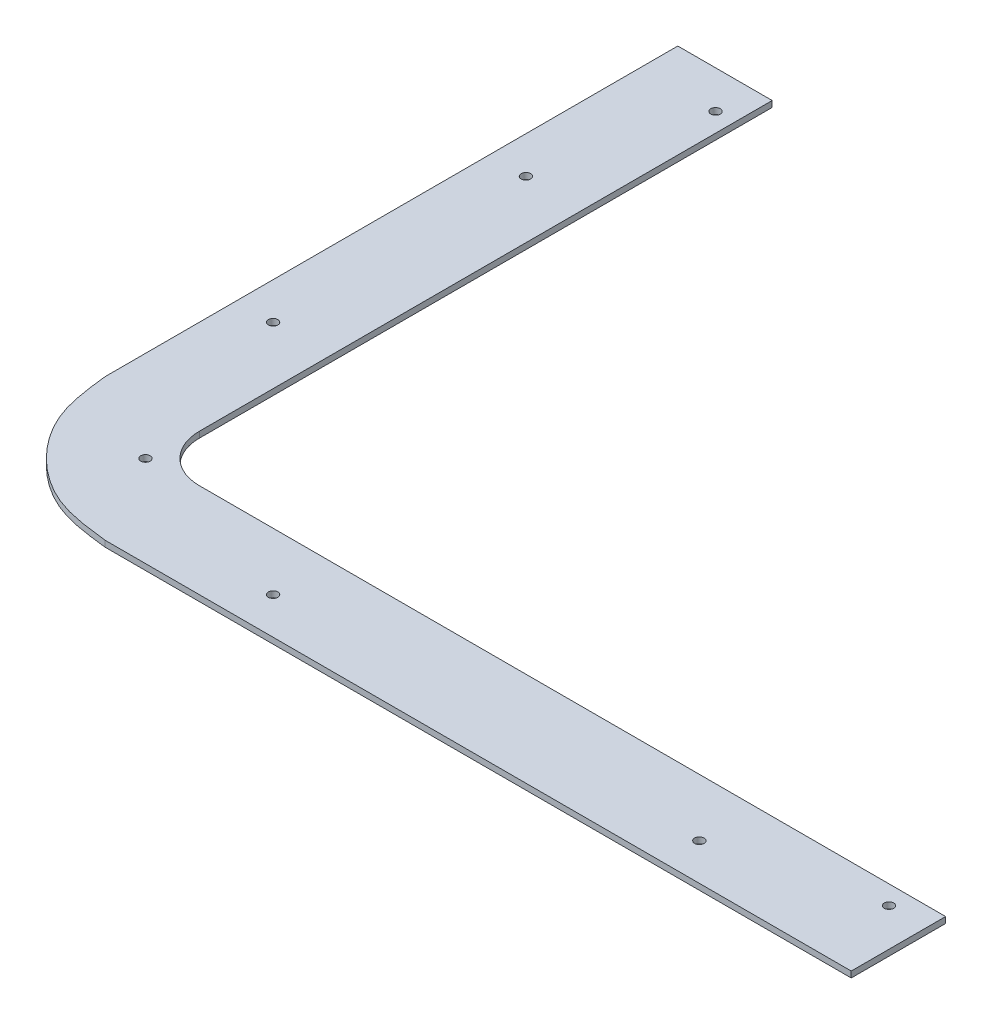
ISO-10303-21;
HEADER;
FILE_DESCRIPTION(('STEP AP214'),'2;1');
FILE_NAME('part.step','',(''),(''),'','','');
FILE_SCHEMA(('AUTOMOTIVE_DESIGN { 1 0 10303 214 1 1 1 1 }'));
ENDSEC;
DATA;
#1=APPLICATION_CONTEXT('core data for automotive mechanical design processes');
#2=APPLICATION_PROTOCOL_DEFINITION('international standard','automotive_design',2000,#1);
#3=PRODUCT_CONTEXT('',#1,'mechanical');
#4=PRODUCT('Part','Part','',(#3));
#5=PRODUCT_RELATED_PRODUCT_CATEGORY('part','',(#4));
#6=PRODUCT_DEFINITION_FORMATION('','',#4);
#7=PRODUCT_DEFINITION_CONTEXT('part definition',#1,'design');
#8=PRODUCT_DEFINITION('design','',#6,#7);
#9=PRODUCT_DEFINITION_SHAPE('','',#8);
#10=(LENGTH_UNIT() NAMED_UNIT(*) SI_UNIT(.MILLI.,.METRE.));
#11=(NAMED_UNIT(*) PLANE_ANGLE_UNIT() SI_UNIT($,.RADIAN.));
#12=(NAMED_UNIT(*) SI_UNIT($,.STERADIAN.) SOLID_ANGLE_UNIT());
#13=UNCERTAINTY_MEASURE_WITH_UNIT(LENGTH_MEASURE(1.E-05),#10,'distance_accuracy_value','');
#14=(GEOMETRIC_REPRESENTATION_CONTEXT(3) GLOBAL_UNCERTAINTY_ASSIGNED_CONTEXT((#13)) GLOBAL_UNIT_ASSIGNED_CONTEXT((#10,
#11,#12)) REPRESENTATION_CONTEXT('',''));
#15=CARTESIAN_POINT('',(0.,0.,0.));
#16=DIRECTION('',(0.,0.,1.));
#17=DIRECTION('',(1.,0.,0.));
#18=AXIS2_PLACEMENT_3D('',#15,#16,#17);
#19=CARTESIAN_POINT('',(145.271732748,-0.0101030776406552,220.));
#20=DIRECTION('',(-1.,0.,0.));
#21=DIRECTION('',(0.,0.,1.));
#22=AXIS2_PLACEMENT_3D('',#19,#20,#21);
#23=PLANE('',#22);
#24=DIRECTION('',(0.,0.,1.));
#25=VECTOR('',#24,1.);
#26=CARTESIAN_POINT('',(145.271732748,453.2,195.));
#27=LINE('',#26,#25);
#28=CARTESIAN_POINT('',(145.271732748,453.2,220.));
#29=VERTEX_POINT('',#28);
#30=CARTESIAN_POINT('',(145.271732748,453.2,270.));
#31=VERTEX_POINT('',#30);
#32=EDGE_CURVE('E109',#29,#31,#27,.T.);
#33=ORIENTED_EDGE('',*,*,#32,.T.);
#34=DIRECTION('',(0.,-1.,0.));
#35=VECTOR('',#34,1.);
#36=CARTESIAN_POINT('',(145.271732748,450.,270.));
#37=LINE('',#36,#35);
#38=CARTESIAN_POINT('',(145.271732748,450.,270.));
#39=VERTEX_POINT('',#38);
#40=EDGE_CURVE('E124',#31,#39,#37,.T.);
#41=ORIENTED_EDGE('',*,*,#40,.T.);
#42=DIRECTION('',(0.,0.,1.));
#43=VECTOR('',#42,1.);
#44=CARTESIAN_POINT('',(145.271732748,450.,195.));
#45=LINE('',#44,#43);
#46=CARTESIAN_POINT('',(145.271732748,450.,220.));
#47=VERTEX_POINT('',#46);
#48=EDGE_CURVE('E111',#47,#39,#45,.T.);
#49=ORIENTED_EDGE('',*,*,#48,.F.);
#50=DIRECTION('',(0.,1.,0.));
#51=VECTOR('',#50,1.);
#52=CARTESIAN_POINT('',(145.271732748,353.2,220.));
#53=LINE('',#52,#51);
#54=EDGE_CURVE('E106',#47,#29,#53,.T.);
#55=ORIENTED_EDGE('',*,*,#54,.T.);
#56=EDGE_LOOP('',(#33,#41,#49,#55));
#57=FACE_BOUND('',#56,.T.);
#58=ADVANCED_FACE('F38',(#57),#23,.F.);
#59=CARTESIAN_POINT('',(-275.,-0.0101030776406552,-108.396227551465));
#60=DIRECTION('',(0.,0.,-1.));
#61=DIRECTION('',(-1.,0.,0.));
#62=AXIS2_PLACEMENT_3D('',#59,#60,#61);
#63=PLANE('',#62);
#64=DIRECTION('',(-1.,0.,0.));
#65=VECTOR('',#64,1.);
#66=CARTESIAN_POINT('',(-250.,453.2,-108.396227551464));
#67=LINE('',#66,#65);
#68=CARTESIAN_POINT('',(-275.,453.2,-108.396227551465));
#69=VERTEX_POINT('',#68);
#70=CARTESIAN_POINT('',(-324.999999998909,453.2,-108.396227551464));
#71=VERTEX_POINT('',#70);
#72=EDGE_CURVE('E138',#69,#71,#67,.T.);
#73=ORIENTED_EDGE('',*,*,#72,.F.);
#74=DIRECTION('',(0.,1.,0.));
#75=VECTOR('',#74,1.);
#76=CARTESIAN_POINT('',(-275.,353.2,-108.396227551465));
#77=LINE('',#76,#75);
#78=CARTESIAN_POINT('',(-275.,450.,-108.396227551465));
#79=VERTEX_POINT('',#78);
#80=EDGE_CURVE('E63',#79,#69,#77,.T.);
#81=ORIENTED_EDGE('',*,*,#80,.F.);
#82=DIRECTION('',(-1.,0.,0.));
#83=VECTOR('',#82,1.);
#84=CARTESIAN_POINT('',(-250.,450.,-108.396227551464));
#85=LINE('',#84,#83);
#86=CARTESIAN_POINT('',(-324.999999998909,450.,-108.396227551464));
#87=VERTEX_POINT('',#86);
#88=EDGE_CURVE('E113',#79,#87,#85,.T.);
#89=ORIENTED_EDGE('',*,*,#88,.T.);
#90=DIRECTION('',(0.,-1.,0.));
#91=VECTOR('',#90,1.);
#92=CARTESIAN_POINT('',(-324.999999998909,450.,-108.396227551464));
#93=LINE('',#92,#91);
#94=EDGE_CURVE('E140',#71,#87,#93,.T.);
#95=ORIENTED_EDGE('',*,*,#94,.F.);
#96=EDGE_LOOP('',(#73,#81,#89,#95));
#97=FACE_BOUND('',#96,.T.);
#98=ADVANCED_FACE('F256',(#97),#63,.T.);
#99=CARTESIAN_POINT('',(-324.999999998909,450.,195.));
#100=DIRECTION('',(-1.,0.,0.));
#101=DIRECTION('',(0.,0.,1.));
#102=AXIS2_PLACEMENT_3D('',#99,#100,#101);
#103=PLANE('',#102);
#104=DIRECTION('',(0.,0.,1.));
#105=VECTOR('',#104,1.);
#106=CARTESIAN_POINT('',(-324.999999998909,453.2,195.));
#107=LINE('',#106,#105);
#108=CARTESIAN_POINT('',(-324.999999999454,453.2,195.));
#109=VERTEX_POINT('',#108);
#110=EDGE_CURVE('E169',#71,#109,#107,.T.);
#111=ORIENTED_EDGE('',*,*,#110,.F.);
#112=ORIENTED_EDGE('',*,*,#94,.T.);
#113=DIRECTION('',(0.,0.,1.));
#114=VECTOR('',#113,1.);
#115=CARTESIAN_POINT('',(-324.999999998909,450.,195.));
#116=LINE('',#115,#114);
#117=CARTESIAN_POINT('',(-324.999999999454,450.,195.));
#118=VERTEX_POINT('',#117);
#119=EDGE_CURVE('E135',#87,#118,#116,.T.);
#120=ORIENTED_EDGE('',*,*,#119,.T.);
#121=CARTESIAN_POINT('',(-325.,453.2,195.));
#122=CARTESIAN_POINT('',(-325.,450.,195.));
#123=B_SPLINE_CURVE_WITH_KNOTS('',1,(#121,#122),.UNSPECIFIED.,.F.,.F.,(2,2),(0.,1.),.UNSPECIFIED.);
#124=EDGE_CURVE('E188',#118,#109,#123,.F.);
#125=ORIENTED_EDGE('',*,*,#124,.T.);
#126=EDGE_LOOP('',(#111,#112,#120,#125));
#127=FACE_BOUND('',#126,.T.);
#128=ADVANCED_FACE('F258',(#127),#103,.T.);
#129=CARTESIAN_POINT('',(-250.,453.2,195.));
#130=DIRECTION('',(0.,1.,0.));
#131=DIRECTION('',(0.,0.,1.));
#132=AXIS2_PLACEMENT_3D('',#129,#130,#131);
#133=PLANE('',#132);
#134=CARTESIAN_POINT('',(-305.45,453.2,-8.39622755146451));
#135=DIRECTION('',(0.,1.,0.));
#136=DIRECTION('',(0.,0.,1.));
#137=AXIS2_PLACEMENT_3D('',#134,#135,#136);
#138=CIRCLE('',#137,2.50000000000002);
#139=CARTESIAN_POINT('',(-305.45,453.2,-5.89622755146448));
#140=VERTEX_POINT('',#139);
#141=EDGE_CURVE('E452',#140,#140,#138,.T.);
#142=ORIENTED_EDGE('',*,*,#141,.F.);
#143=EDGE_LOOP('',(#142));
#144=FACE_BOUND('',#143,.T.);
#145=CARTESIAN_POINT('',(-305.45,453.2,125.512644459873));
#146=DIRECTION('',(0.,1.,0.));
#147=DIRECTION('',(0.,0.,1.));
#148=AXIS2_PLACEMENT_3D('',#145,#146,#147);
#149=CIRCLE('',#148,2.50000000000002);
#150=CARTESIAN_POINT('',(-305.45,453.2,128.012644459873));
#151=VERTEX_POINT('',#150);
#152=EDGE_CURVE('E454',#151,#151,#149,.T.);
#153=ORIENTED_EDGE('',*,*,#152,.F.);
#154=EDGE_LOOP('',(#153));
#155=FACE_BOUND('',#154,.T.);
#156=CARTESIAN_POINT('',(-180.512645029273,453.2,250.45));
#157=DIRECTION('',(0.,1.,0.));
#158=DIRECTION('',(0.,0.,1.));
#159=AXIS2_PLACEMENT_3D('',#156,#157,#158);
#160=CIRCLE('',#159,2.5);
#161=CARTESIAN_POINT('',(-180.512645029273,453.2,252.95));
#162=VERTEX_POINT('',#161);
#163=EDGE_CURVE('E460',#162,#162,#160,.T.);
#164=ORIENTED_EDGE('',*,*,#163,.F.);
#165=EDGE_LOOP('',(#164));
#166=FACE_BOUND('',#165,.T.);
#167=CARTESIAN_POINT('',(45.2717327480002,453.2,250.45));
#168=DIRECTION('',(0.,1.,0.));
#169=DIRECTION('',(0.,0.,1.));
#170=AXIS2_PLACEMENT_3D('',#167,#168,#169);
#171=CIRCLE('',#170,2.50000000000001);
#172=CARTESIAN_POINT('',(45.2717327480002,453.2,252.95));
#173=VERTEX_POINT('',#172);
#174=EDGE_CURVE('E464',#173,#173,#171,.T.);
#175=ORIENTED_EDGE('',*,*,#174,.F.);
#176=EDGE_LOOP('',(#175));
#177=FACE_BOUND('',#176,.T.);
#178=CARTESIAN_POINT('',(-276.782224708341,453.2,221.782224708341));
#179=DIRECTION('',(0.,1.,0.));
#180=DIRECTION('',(0.,0.,1.));
#181=AXIS2_PLACEMENT_3D('',#178,#179,#180);
#182=CIRCLE('',#181,2.50000000000002);
#183=CARTESIAN_POINT('',(-276.782224708341,453.2,224.282224708341));
#184=VERTEX_POINT('',#183);
#185=EDGE_CURVE('E468',#184,#184,#182,.T.);
#186=ORIENTED_EDGE('',*,*,#185,.F.);
#187=EDGE_LOOP('',(#186));
#188=FACE_BOUND('',#187,.T.);
#189=CARTESIAN_POINT('',(125.271732748,453.2,230.));
#190=DIRECTION('',(0.,1.,0.));
#191=DIRECTION('',(0.,0.,1.));
#192=AXIS2_PLACEMENT_3D('',#189,#190,#191);
#193=CIRCLE('',#192,2.5);
#194=CARTESIAN_POINT('',(125.271732748,453.2,232.5));
#195=VERTEX_POINT('',#194);
#196=EDGE_CURVE('E471',#195,#195,#193,.T.);
#197=ORIENTED_EDGE('',*,*,#196,.F.);
#198=EDGE_LOOP('',(#197));
#199=FACE_BOUND('',#198,.T.);
#200=CARTESIAN_POINT('',(-285.,453.2,-88.3962275514643));
#201=DIRECTION('',(0.,1.,0.));
#202=DIRECTION('',(0.,0.,1.));
#203=AXIS2_PLACEMENT_3D('',#200,#201,#202);
#204=CIRCLE('',#203,2.50000000000002);
#205=CARTESIAN_POINT('',(-285.,453.2,-85.8962275514643));
#206=VERTEX_POINT('',#205);
#207=EDGE_CURVE('E473',#206,#206,#204,.T.);
#208=ORIENTED_EDGE('',*,*,#207,.F.);
#209=EDGE_LOOP('',(#208));
#210=FACE_BOUND('',#209,.T.);
#211=DIRECTION('',(0.,0.,1.));
#212=VECTOR('',#211,1.);
#213=CARTESIAN_POINT('',(-275.,453.2,-108.396227551465));
#214=LINE('',#213,#212);
#215=CARTESIAN_POINT('',(-275.,453.2,195.));
#216=VERTEX_POINT('',#215);
#217=EDGE_CURVE('E11',#69,#216,#214,.T.);
#218=ORIENTED_EDGE('',*,*,#217,.F.);
#219=ORIENTED_EDGE('',*,*,#72,.T.);
#220=ORIENTED_EDGE('',*,*,#110,.T.);
#221=CARTESIAN_POINT('',(-250.,453.2,270.));
#222=CARTESIAN_POINT('',(-259.827778237488,453.2,268.872631961738));
#223=CARTESIAN_POINT('',(-269.655556474975,453.2,267.745263923477));
#224=CARTESIAN_POINT('',(-287.746958379187,453.2,260.836665952459));
#225=CARTESIAN_POINT('',(-296.010582045911,453.2,255.055436019697));
#226=CARTESIAN_POINT('',(-310.055435211312,453.2,241.010581076895));
#227=CARTESIAN_POINT('',(-315.836665535041,453.2,232.746956891908));
#228=CARTESIAN_POINT('',(-322.745269897047,453.2,214.655555704924));
#229=CARTESIAN_POINT('',(-323.872634948536,453.2,204.827777852463));
#230=CARTESIAN_POINT('',(-325.,453.2,195.));
#231=B_SPLINE_CURVE_WITH_KNOTS('',3,(#221,#222,#223,#224,#225,#226,#227,#228,#229,#230),
.UNSPECIFIED.,.F.,.F.,(4,2,2,2,4),(0.,0.25,0.5,0.75,1.),.UNSPECIFIED.);
#232=CARTESIAN_POINT('',(-250.,453.2,270.));
#233=VERTEX_POINT('',#232);
#234=EDGE_CURVE('E154',#109,#233,#231,.F.);
#235=ORIENTED_EDGE('',*,*,#234,.T.);
#236=DIRECTION('',(1.,0.,0.));
#237=VECTOR('',#236,1.);
#238=CARTESIAN_POINT('',(-250.,453.2,270.));
#239=LINE('',#238,#237);
#240=EDGE_CURVE('E123',#233,#31,#239,.T.);
#241=ORIENTED_EDGE('',*,*,#240,.T.);
#242=ORIENTED_EDGE('',*,*,#32,.F.);
#243=DIRECTION('',(1.,0.,0.));
#244=VECTOR('',#243,1.);
#245=CARTESIAN_POINT('',(-250.,453.2,220.));
#246=LINE('',#245,#244);
#247=CARTESIAN_POINT('',(-250.,453.2,220.));
#248=VERTEX_POINT('',#247);
#249=EDGE_CURVE('E120',#248,#29,#246,.T.);
#250=ORIENTED_EDGE('',*,*,#249,.F.);
#251=CARTESIAN_POINT('',(-250.,453.2,195.));
#252=DIRECTION('',(0.,1.,0.));
#253=DIRECTION('',(0.,0.,1.));
#254=AXIS2_PLACEMENT_3D('',#251,#252,#253);
#255=CIRCLE('',#254,25.);
#256=EDGE_CURVE('E48',#216,#248,#255,.T.);
#257=ORIENTED_EDGE('',*,*,#256,.F.);
#258=EDGE_LOOP('',(#218,#219,#220,#235,#241,#242,#250,#257));
#259=FACE_BOUND('',#258,.T.);
#260=ADVANCED_FACE('F40',(#144,#155,#166,#177,#188,#199,#210,#259),#133,.T.);
#261=CARTESIAN_POINT('',(-250.,450.,195.));
#262=DIRECTION('',(0.,1.,0.));
#263=DIRECTION('',(0.,0.,1.));
#264=AXIS2_PLACEMENT_3D('',#261,#262,#263);
#265=PLANE('',#264);
#266=CARTESIAN_POINT('',(-305.45,450.,-8.39622755146451));
#267=DIRECTION('',(0.,1.,0.));
#268=DIRECTION('',(0.,0.,1.));
#269=AXIS2_PLACEMENT_3D('',#266,#267,#268);
#270=CIRCLE('',#269,2.50000000000002);
#271=CARTESIAN_POINT('',(-305.45,450.,-5.89622755146448));
#272=VERTEX_POINT('',#271);
#273=EDGE_CURVE('E43',#272,#272,#270,.T.);
#274=ORIENTED_EDGE('',*,*,#273,.T.);
#275=EDGE_LOOP('',(#274));
#276=FACE_BOUND('',#275,.T.);
#277=CARTESIAN_POINT('',(-305.45,450.,125.512644459873));
#278=DIRECTION('',(0.,1.,0.));
#279=DIRECTION('',(0.,0.,1.));
#280=AXIS2_PLACEMENT_3D('',#277,#278,#279);
#281=CIRCLE('',#280,2.50000000000002);
#282=CARTESIAN_POINT('',(-305.45,450.,128.012644459873));
#283=VERTEX_POINT('',#282);
#284=EDGE_CURVE('E456',#283,#283,#281,.T.);
#285=ORIENTED_EDGE('',*,*,#284,.T.);
#286=EDGE_LOOP('',(#285));
#287=FACE_BOUND('',#286,.T.);
#288=CARTESIAN_POINT('',(-180.512645029273,450.,250.45));
#289=DIRECTION('',(0.,1.,0.));
#290=DIRECTION('',(0.,0.,1.));
#291=AXIS2_PLACEMENT_3D('',#288,#289,#290);
#292=CIRCLE('',#291,2.5);
#293=CARTESIAN_POINT('',(-180.512645029273,450.,252.95));
#294=VERTEX_POINT('',#293);
#295=EDGE_CURVE('E463',#294,#294,#292,.T.);
#296=ORIENTED_EDGE('',*,*,#295,.T.);
#297=EDGE_LOOP('',(#296));
#298=FACE_BOUND('',#297,.T.);
#299=CARTESIAN_POINT('',(45.2717327480002,450.,250.45));
#300=DIRECTION('',(0.,1.,0.));
#301=DIRECTION('',(0.,0.,1.));
#302=AXIS2_PLACEMENT_3D('',#299,#300,#301);
#303=CIRCLE('',#302,2.50000000000001);
#304=CARTESIAN_POINT('',(45.2717327480002,450.,252.95));
#305=VERTEX_POINT('',#304);
#306=EDGE_CURVE('E467',#305,#305,#303,.T.);
#307=ORIENTED_EDGE('',*,*,#306,.T.);
#308=EDGE_LOOP('',(#307));
#309=FACE_BOUND('',#308,.T.);
#310=CARTESIAN_POINT('',(-276.782224708341,450.,221.782224708341));
#311=DIRECTION('',(0.,1.,0.));
#312=DIRECTION('',(0.,0.,1.));
#313=AXIS2_PLACEMENT_3D('',#310,#311,#312);
#314=CIRCLE('',#313,2.50000000000002);
#315=CARTESIAN_POINT('',(-276.782224708341,450.,224.282224708341));
#316=VERTEX_POINT('',#315);
#317=EDGE_CURVE('E114',#316,#316,#314,.T.);
#318=ORIENTED_EDGE('',*,*,#317,.T.);
#319=EDGE_LOOP('',(#318));
#320=FACE_BOUND('',#319,.T.);
#321=CARTESIAN_POINT('',(125.271732748,450.,230.));
#322=DIRECTION('',(0.,1.,0.));
#323=DIRECTION('',(0.,0.,1.));
#324=AXIS2_PLACEMENT_3D('',#321,#322,#323);
#325=CIRCLE('',#324,2.5);
#326=CARTESIAN_POINT('',(125.271732748,450.,232.5));
#327=VERTEX_POINT('',#326);
#328=EDGE_CURVE('E495',#327,#327,#325,.T.);
#329=ORIENTED_EDGE('',*,*,#328,.T.);
#330=EDGE_LOOP('',(#329));
#331=FACE_BOUND('',#330,.T.);
#332=CARTESIAN_POINT('',(-285.,450.,-88.3962275514643));
#333=DIRECTION('',(0.,1.,0.));
#334=DIRECTION('',(0.,0.,1.));
#335=AXIS2_PLACEMENT_3D('',#332,#333,#334);
#336=CIRCLE('',#335,2.50000000000002);
#337=CARTESIAN_POINT('',(-285.,450.,-85.8962275514643));
#338=VERTEX_POINT('',#337);
#339=EDGE_CURVE('E174',#338,#338,#336,.T.);
#340=ORIENTED_EDGE('',*,*,#339,.T.);
#341=EDGE_LOOP('',(#340));
#342=FACE_BOUND('',#341,.T.);
#343=ORIENTED_EDGE('',*,*,#88,.F.);
#344=DIRECTION('',(0.,0.,1.));
#345=VECTOR('',#344,1.);
#346=CARTESIAN_POINT('',(-275.,450.,195.));
#347=LINE('',#346,#345);
#348=CARTESIAN_POINT('',(-275.,450.,195.));
#349=VERTEX_POINT('',#348);
#350=EDGE_CURVE('E137',#79,#349,#347,.T.);
#351=ORIENTED_EDGE('',*,*,#350,.T.);
#352=CARTESIAN_POINT('',(-250.,450.,195.));
#353=DIRECTION('',(0.,1.,0.));
#354=DIRECTION('',(0.,0.,1.));
#355=AXIS2_PLACEMENT_3D('',#352,#353,#354);
#356=CIRCLE('',#355,25.);
#357=CARTESIAN_POINT('',(-250.,450.,220.));
#358=VERTEX_POINT('',#357);
#359=EDGE_CURVE('E185',#349,#358,#356,.T.);
#360=ORIENTED_EDGE('',*,*,#359,.T.);
#361=DIRECTION('',(1.,0.,0.));
#362=VECTOR('',#361,1.);
#363=CARTESIAN_POINT('',(-250.,450.,220.));
#364=LINE('',#363,#362);
#365=EDGE_CURVE('E183',#358,#47,#364,.T.);
#366=ORIENTED_EDGE('',*,*,#365,.T.);
#367=ORIENTED_EDGE('',*,*,#48,.T.);
#368=DIRECTION('',(1.,0.,0.));
#369=VECTOR('',#368,1.);
#370=CARTESIAN_POINT('',(-250.,450.,270.));
#371=LINE('',#370,#369);
#372=CARTESIAN_POINT('',(-250.,450.,270.));
#373=VERTEX_POINT('',#372);
#374=EDGE_CURVE('E160',#373,#39,#371,.T.);
#375=ORIENTED_EDGE('',*,*,#374,.F.);
#376=CARTESIAN_POINT('',(-325.,450.,195.));
#377=CARTESIAN_POINT('',(-323.872634948536,450.,204.827777852463));
#378=CARTESIAN_POINT('',(-322.745269897047,450.,214.655555704924));
#379=CARTESIAN_POINT('',(-315.836665535041,450.,232.746956891908));
#380=CARTESIAN_POINT('',(-310.055435211312,450.,241.010581076895));
#381=CARTESIAN_POINT('',(-296.010582045911,450.,255.055436019697));
#382=CARTESIAN_POINT('',(-287.746958379187,450.,260.836665952459));
#383=CARTESIAN_POINT('',(-269.655556474975,450.,267.745263923477));
#384=CARTESIAN_POINT('',(-259.827778237488,450.,268.872631961738));
#385=CARTESIAN_POINT('',(-250.,450.,270.));
#386=B_SPLINE_CURVE_WITH_KNOTS('',3,(#376,#377,#378,#379,#380,#381,#382,#383,#384,#385),
.UNSPECIFIED.,.F.,.F.,(4,2,2,2,4),(0.,0.25,0.5,0.75,1.),.UNSPECIFIED.);
#387=EDGE_CURVE('E168',#118,#373,#386,.T.);
#388=ORIENTED_EDGE('',*,*,#387,.F.);
#389=ORIENTED_EDGE('',*,*,#119,.F.);
#390=EDGE_LOOP('',(#343,#351,#360,#366,#367,#375,#388,#389));
#391=FACE_BOUND('',#390,.T.);
#392=ADVANCED_FACE('F208',(#276,#287,#298,#309,#320,#331,#342,#391),#265,.F.);
#393=CARTESIAN_POINT('',(-325.,453.2,195.));
#394=CARTESIAN_POINT('',(-323.872634948536,453.2,204.827777852463));
#395=CARTESIAN_POINT('',(-322.745269897047,453.2,214.655555704924));
#396=CARTESIAN_POINT('',(-315.836665535041,453.2,232.746956891908));
#397=CARTESIAN_POINT('',(-310.055435211312,453.2,241.010581076895));
#398=CARTESIAN_POINT('',(-296.010582045911,453.2,255.055436019697));
#399=CARTESIAN_POINT('',(-287.746958379187,453.2,260.836665952459));
#400=CARTESIAN_POINT('',(-269.655556474975,453.2,267.745263923477));
#401=CARTESIAN_POINT('',(-259.827778237488,453.2,268.872631961738));
#402=CARTESIAN_POINT('',(-250.,453.2,270.));
#403=CARTESIAN_POINT('',(-325.,450.,195.));
#404=CARTESIAN_POINT('',(-323.872634948536,450.,204.827777852463));
#405=CARTESIAN_POINT('',(-322.745269897047,450.,214.655555704924));
#406=CARTESIAN_POINT('',(-315.836665535041,450.,232.746956891908));
#407=CARTESIAN_POINT('',(-310.055435211312,450.,241.010581076895));
#408=CARTESIAN_POINT('',(-296.010582045911,450.,255.055436019697));
#409=CARTESIAN_POINT('',(-287.746958379187,450.,260.836665952459));
#410=CARTESIAN_POINT('',(-269.655556474975,450.,267.745263923477));
#411=CARTESIAN_POINT('',(-259.827778237488,450.,268.872631961738));
#412=CARTESIAN_POINT('',(-250.,450.,270.));
#413=B_SPLINE_SURFACE_WITH_KNOTS('',1,3,((#393,#394,#395,#396,#397,#398,#399,#400,#401,#402),
(#403,#404,#405,#406,#407,#408,#409,#410,#411,#412)),.UNSPECIFIED.,.F.,.F.,.F.,(2,2),(4,2,2,2,
4),(0.,1.),(0.,0.25,0.5,0.75,1.),.UNSPECIFIED.);
#414=CARTESIAN_POINT('',(-250.,450.,270.));
#415=CARTESIAN_POINT('',(-250.,453.2,270.));
#416=B_SPLINE_CURVE_WITH_KNOTS('',1,(#414,#415),.UNSPECIFIED.,.F.,.F.,(2,2),(0.,1.),.UNSPECIFIED.);
#417=EDGE_CURVE('E155',#373,#233,#416,.T.);
#418=ORIENTED_EDGE('',*,*,#124,.F.);
#419=ORIENTED_EDGE('',*,*,#387,.T.);
#420=ORIENTED_EDGE('',*,*,#417,.T.);
#421=ORIENTED_EDGE('',*,*,#234,.F.);
#422=EDGE_LOOP('',(#418,#419,#420,#421));
#423=FACE_BOUND('',#422,.T.);
#424=ADVANCED_FACE('F195',(#423),#413,.T.);
#425=CARTESIAN_POINT('',(-250.,450.,270.));
#426=DIRECTION('',(0.,0.,1.));
#427=DIRECTION('',(1.,0.,0.));
#428=AXIS2_PLACEMENT_3D('',#425,#426,#427);
#429=PLANE('',#428);
#430=ORIENTED_EDGE('',*,*,#40,.F.);
#431=ORIENTED_EDGE('',*,*,#240,.F.);
#432=ORIENTED_EDGE('',*,*,#417,.F.);
#433=ORIENTED_EDGE('',*,*,#374,.T.);
#434=EDGE_LOOP('',(#430,#431,#432,#433));
#435=FACE_BOUND('',#434,.T.);
#436=ADVANCED_FACE('F207',(#435),#429,.T.);
#437=CARTESIAN_POINT('',(-275.,353.2,-108.396227551465));
#438=DIRECTION('',(-1.,0.,0.));
#439=DIRECTION('',(0.,0.,1.));
#440=AXIS2_PLACEMENT_3D('',#437,#438,#439);
#441=PLANE('',#440);
#442=ORIENTED_EDGE('',*,*,#80,.T.);
#443=ORIENTED_EDGE('',*,*,#217,.T.);
#444=DIRECTION('',(0.,1.,0.));
#445=VECTOR('',#444,1.);
#446=CARTESIAN_POINT('',(-275.,353.2,195.));
#447=LINE('',#446,#445);
#448=EDGE_CURVE('E127',#349,#216,#447,.T.);
#449=ORIENTED_EDGE('',*,*,#448,.F.);
#450=ORIENTED_EDGE('',*,*,#350,.F.);
#451=EDGE_LOOP('',(#442,#443,#449,#450));
#452=FACE_BOUND('',#451,.T.);
#453=ADVANCED_FACE('F212',(#452),#441,.F.);
#454=CARTESIAN_POINT('',(-250.,353.2,220.));
#455=DIRECTION('',(0.,0.,1.));
#456=DIRECTION('',(1.,0.,0.));
#457=AXIS2_PLACEMENT_3D('',#454,#455,#456);
#458=PLANE('',#457);
#459=DIRECTION('',(0.,1.,0.));
#460=VECTOR('',#459,1.);
#461=CARTESIAN_POINT('',(-250.,353.2,220.));
#462=LINE('',#461,#460);
#463=EDGE_CURVE('E56',#358,#248,#462,.T.);
#464=ORIENTED_EDGE('',*,*,#463,.T.);
#465=ORIENTED_EDGE('',*,*,#249,.T.);
#466=ORIENTED_EDGE('',*,*,#54,.F.);
#467=ORIENTED_EDGE('',*,*,#365,.F.);
#468=EDGE_LOOP('',(#464,#465,#466,#467));
#469=FACE_BOUND('',#468,.T.);
#470=ADVANCED_FACE('F126',(#469),#458,.F.);
#471=CARTESIAN_POINT('',(-250.,353.2,195.));
#472=DIRECTION('',(0.,1.,0.));
#473=DIRECTION('',(0.,0.,1.));
#474=AXIS2_PLACEMENT_3D('',#471,#472,#473);
#475=CYLINDRICAL_SURFACE('',#474,25.);
#476=ORIENTED_EDGE('',*,*,#448,.T.);
#477=ORIENTED_EDGE('',*,*,#256,.T.);
#478=ORIENTED_EDGE('',*,*,#463,.F.);
#479=ORIENTED_EDGE('',*,*,#359,.F.);
#480=EDGE_LOOP('',(#476,#477,#478,#479));
#481=FACE_BOUND('',#480,.T.);
#482=ADVANCED_FACE('F253',(#481),#475,.F.);
#483=CARTESIAN_POINT('',(-285.,423.2,-88.3962275514643));
#484=DIRECTION('',(0.,1.,0.));
#485=DIRECTION('',(0.,0.,1.));
#486=AXIS2_PLACEMENT_3D('',#483,#484,#485);
#487=CYLINDRICAL_SURFACE('',#486,2.50000000000002);
#488=ORIENTED_EDGE('',*,*,#207,.T.);
#489=EDGE_LOOP('',(#488));
#490=FACE_BOUND('',#489,.T.);
#491=ORIENTED_EDGE('',*,*,#339,.F.);
#492=EDGE_LOOP('',(#491));
#493=FACE_BOUND('',#492,.T.);
#494=ADVANCED_FACE('F210',(#490,#493),#487,.F.);
#495=CARTESIAN_POINT('',(125.271732748,423.2,230.));
#496=DIRECTION('',(0.,1.,0.));
#497=DIRECTION('',(0.,0.,1.));
#498=AXIS2_PLACEMENT_3D('',#495,#496,#497);
#499=CYLINDRICAL_SURFACE('',#498,2.5);
#500=ORIENTED_EDGE('',*,*,#196,.T.);
#501=EDGE_LOOP('',(#500));
#502=FACE_BOUND('',#501,.T.);
#503=ORIENTED_EDGE('',*,*,#328,.F.);
#504=EDGE_LOOP('',(#503));
#505=FACE_BOUND('',#504,.T.);
#506=ADVANCED_FACE('F316',(#502,#505),#499,.F.);
#507=CARTESIAN_POINT('',(-276.782224708341,423.2,221.782224708341));
#508=DIRECTION('',(0.,1.,0.));
#509=DIRECTION('',(0.,0.,1.));
#510=AXIS2_PLACEMENT_3D('',#507,#508,#509);
#511=CYLINDRICAL_SURFACE('',#510,2.50000000000002);
#512=ORIENTED_EDGE('',*,*,#185,.T.);
#513=EDGE_LOOP('',(#512));
#514=FACE_BOUND('',#513,.T.);
#515=ORIENTED_EDGE('',*,*,#317,.F.);
#516=EDGE_LOOP('',(#515));
#517=FACE_BOUND('',#516,.T.);
#518=ADVANCED_FACE('F388',(#514,#517),#511,.F.);
#519=CARTESIAN_POINT('',(45.2717327480002,449.991975,250.45));
#520=DIRECTION('',(0.,1.,0.));
#521=DIRECTION('',(0.,0.,1.));
#522=AXIS2_PLACEMENT_3D('',#519,#520,#521);
#523=CYLINDRICAL_SURFACE('',#522,2.50000000000001);
#524=CARTESIAN_POINT('',(45.2717327480002,453.2,252.95));
#525=CARTESIAN_POINT('',(45.2717327480002,453.166666666667,252.95));
#526=CARTESIAN_POINT('',(45.2717327480002,453.133333333333,252.95));
#527=CARTESIAN_POINT('',(45.2717327480002,453.066666666667,252.95));
#528=CARTESIAN_POINT('',(45.2717327480002,453.033333333333,252.95));
#529=CARTESIAN_POINT('',(45.2717327480002,452.966666666667,252.95));
#530=CARTESIAN_POINT('',(45.2717327480002,452.933333333333,252.95));
#531=CARTESIAN_POINT('',(45.2717327480002,452.866666666667,252.95));
#532=CARTESIAN_POINT('',(45.2717327480002,452.833333333333,252.95));
#533=CARTESIAN_POINT('',(45.2717327480002,452.766666666667,252.95));
#534=CARTESIAN_POINT('',(45.2717327480002,452.733333333333,252.95));
#535=CARTESIAN_POINT('',(45.2717327480002,452.666666666667,252.95));
#536=CARTESIAN_POINT('',(45.2717327480002,452.633333333333,252.95));
#537=CARTESIAN_POINT('',(45.2717327480002,452.566666666667,252.95));
#538=CARTESIAN_POINT('',(45.2717327480002,452.533333333333,252.95));
#539=CARTESIAN_POINT('',(45.2717327480002,452.466666666667,252.95));
#540=CARTESIAN_POINT('',(45.2717327480002,452.433333333333,252.95));
#541=CARTESIAN_POINT('',(45.2717327480002,452.366666666667,252.95));
#542=CARTESIAN_POINT('',(45.2717327480002,452.333333333333,252.95));
#543=CARTESIAN_POINT('',(45.2717327480002,452.266666666667,252.95));
#544=CARTESIAN_POINT('',(45.2717327480002,452.233333333333,252.95));
#545=CARTESIAN_POINT('',(45.2717327480002,452.166666666667,252.95));
#546=CARTESIAN_POINT('',(45.2717327480002,452.133333333333,252.95));
#547=CARTESIAN_POINT('',(45.2717327480002,452.066666666667,252.95));
#548=CARTESIAN_POINT('',(45.2717327480002,452.033333333333,252.95));
#549=CARTESIAN_POINT('',(45.2717327480002,451.966666666667,252.95));
#550=CARTESIAN_POINT('',(45.2717327480002,451.933333333333,252.95));
#551=CARTESIAN_POINT('',(45.2717327480002,451.866666666667,252.95));
#552=CARTESIAN_POINT('',(45.2717327480002,451.833333333333,252.95));
#553=CARTESIAN_POINT('',(45.2717327480002,451.766666666667,252.95));
#554=CARTESIAN_POINT('',(45.2717327480002,451.733333333333,252.95));
#555=CARTESIAN_POINT('',(45.2717327480002,451.666666666667,252.95));
#556=CARTESIAN_POINT('',(45.2717327480002,451.633333333333,252.95));
#557=CARTESIAN_POINT('',(45.2717327480002,451.566666666667,252.95));
#558=CARTESIAN_POINT('',(45.2717327480002,451.533333333333,252.95));
#559=CARTESIAN_POINT('',(45.2717327480002,451.466666666667,252.95));
#560=CARTESIAN_POINT('',(45.2717327480002,451.433333333333,252.95));
#561=CARTESIAN_POINT('',(45.2717327480002,451.366666666667,252.95));
#562=CARTESIAN_POINT('',(45.2717327480002,451.333333333333,252.95));
#563=CARTESIAN_POINT('',(45.2717327480002,451.266666666667,252.95));
#564=CARTESIAN_POINT('',(45.2717327480002,451.233333333333,252.95));
#565=CARTESIAN_POINT('',(45.2717327480002,451.166666666667,252.95));
#566=CARTESIAN_POINT('',(45.2717327480002,451.133333333333,252.95));
#567=CARTESIAN_POINT('',(45.2717327480002,451.066666666667,252.95));
#568=CARTESIAN_POINT('',(45.2717327480002,451.033333333333,252.95));
#569=CARTESIAN_POINT('',(45.2717327480002,450.966666666667,252.95));
#570=CARTESIAN_POINT('',(45.2717327480002,450.933333333333,252.95));
#571=CARTESIAN_POINT('',(45.2717327480002,450.866666666667,252.95));
#572=CARTESIAN_POINT('',(45.2717327480002,450.833333333333,252.95));
#573=CARTESIAN_POINT('',(45.2717327480002,450.766666666667,252.95));
#574=CARTESIAN_POINT('',(45.2717327480002,450.733333333333,252.95));
#575=CARTESIAN_POINT('',(45.2717327480002,450.666666666667,252.95));
#576=CARTESIAN_POINT('',(45.2717327480002,450.633333333333,252.95));
#577=CARTESIAN_POINT('',(45.2717327480002,450.566666666667,252.95));
#578=CARTESIAN_POINT('',(45.2717327480002,450.533333333333,252.95));
#579=CARTESIAN_POINT('',(45.2717327480002,450.466666666667,252.95));
#580=CARTESIAN_POINT('',(45.2717327480002,450.433333333333,252.95));
#581=CARTESIAN_POINT('',(45.2717327480002,450.366666666667,252.95));
#582=CARTESIAN_POINT('',(45.2717327480002,450.333333333333,252.95));
#583=CARTESIAN_POINT('',(45.2717327480002,450.266666666667,252.95));
#584=CARTESIAN_POINT('',(45.2717327480002,450.233333333333,252.95));
#585=CARTESIAN_POINT('',(45.2717327480002,450.166666666667,252.95));
#586=CARTESIAN_POINT('',(45.2717327480002,450.133333333333,252.95));
#587=CARTESIAN_POINT('',(45.2717327480002,450.066666666667,252.95));
#588=CARTESIAN_POINT('',(45.2717327480002,450.033333333333,252.95));
#589=CARTESIAN_POINT('',(45.2717327480002,450.,252.95));
#590=B_SPLINE_CURVE_WITH_KNOTS('',3,(#524,#525,#526,#527,#528,#529,#530,#531,#532,#533,#534,
#535,#536,#537,#538,#539,#540,#541,#542,#543,#544,#545,#546,#547,#548,#549,#550,#551,#552,#553,
#554,#555,#556,#557,#558,#559,#560,#561,#562,#563,#564,#565,#566,#567,#568,#569,#570,#571,#572,
#573,#574,#575,#576,#577,#578,#579,#580,#581,#582,#583,#584,#585,#586,#587,#588,#589),
.UNSPECIFIED.,.F.,.F.,(4,2,2,2,2,2,2,2,2,2,2,2,2,2,2,2,2,2,2,2,2,2,2,2,2,2,2,2,2,2,2,2,4),(0.,
0.100000000000044,0.200000000000033,0.300000000000022,0.400000000000011,0.5,0.600000000000045,
0.700000000000034,0.800000000000023,0.900000000000012,1.,1.10000000000005,1.20000000000003,
1.30000000000002,1.40000000000001,1.5,1.59999999999999,1.70000000000003,1.80000000000002,
1.90000000000001,2.,2.09999999999999,2.20000000000004,2.30000000000002,2.40000000000001,2.5,
2.59999999999999,2.70000000000004,2.80000000000002,2.90000000000001,3.,3.09999999999999,
3.20000000000004),.UNSPECIFIED.);
#591=EDGE_CURVE('BSEAM396',#173,#305,#590,.T.);
#592=ORIENTED_EDGE('',*,*,#174,.T.);
#593=ORIENTED_EDGE('',*,*,#306,.F.);
#594=ORIENTED_EDGE('',*,*,#591,.T.);
#595=ORIENTED_EDGE('',*,*,#591,.F.);
#596=EDGE_LOOP('',(#592,#594,#593,#595));
#597=FACE_BOUND('',#596,.T.);
#598=ADVANCED_FACE('F396',(#597),#523,.F.);
#599=CARTESIAN_POINT('',(-180.512645029273,449.991975,250.45));
#600=DIRECTION('',(0.,1.,0.));
#601=DIRECTION('',(0.,0.,1.));
#602=AXIS2_PLACEMENT_3D('',#599,#600,#601);
#603=CYLINDRICAL_SURFACE('',#602,2.5);
#604=CARTESIAN_POINT('',(-180.512645029273,453.2,252.95));
#605=CARTESIAN_POINT('',(-180.512645029273,453.166666666667,252.95));
#606=CARTESIAN_POINT('',(-180.512645029273,453.133333333333,252.95));
#607=CARTESIAN_POINT('',(-180.512645029273,453.066666666667,252.95));
#608=CARTESIAN_POINT('',(-180.512645029273,453.033333333333,252.95));
#609=CARTESIAN_POINT('',(-180.512645029273,452.966666666667,252.95));
#610=CARTESIAN_POINT('',(-180.512645029273,452.933333333333,252.95));
#611=CARTESIAN_POINT('',(-180.512645029273,452.866666666667,252.95));
#612=CARTESIAN_POINT('',(-180.512645029273,452.833333333333,252.95));
#613=CARTESIAN_POINT('',(-180.512645029273,452.766666666667,252.95));
#614=CARTESIAN_POINT('',(-180.512645029273,452.733333333333,252.95));
#615=CARTESIAN_POINT('',(-180.512645029273,452.666666666667,252.95));
#616=CARTESIAN_POINT('',(-180.512645029273,452.633333333333,252.95));
#617=CARTESIAN_POINT('',(-180.512645029273,452.566666666667,252.95));
#618=CARTESIAN_POINT('',(-180.512645029273,452.533333333333,252.95));
#619=CARTESIAN_POINT('',(-180.512645029273,452.466666666667,252.95));
#620=CARTESIAN_POINT('',(-180.512645029273,452.433333333333,252.95));
#621=CARTESIAN_POINT('',(-180.512645029273,452.366666666667,252.95));
#622=CARTESIAN_POINT('',(-180.512645029273,452.333333333333,252.95));
#623=CARTESIAN_POINT('',(-180.512645029273,452.266666666667,252.95));
#624=CARTESIAN_POINT('',(-180.512645029273,452.233333333333,252.95));
#625=CARTESIAN_POINT('',(-180.512645029273,452.166666666667,252.95));
#626=CARTESIAN_POINT('',(-180.512645029273,452.133333333333,252.95));
#627=CARTESIAN_POINT('',(-180.512645029273,452.066666666667,252.95));
#628=CARTESIAN_POINT('',(-180.512645029273,452.033333333333,252.95));
#629=CARTESIAN_POINT('',(-180.512645029273,451.966666666667,252.95));
#630=CARTESIAN_POINT('',(-180.512645029273,451.933333333333,252.95));
#631=CARTESIAN_POINT('',(-180.512645029273,451.866666666667,252.95));
#632=CARTESIAN_POINT('',(-180.512645029273,451.833333333333,252.95));
#633=CARTESIAN_POINT('',(-180.512645029273,451.766666666667,252.95));
#634=CARTESIAN_POINT('',(-180.512645029273,451.733333333333,252.95));
#635=CARTESIAN_POINT('',(-180.512645029273,451.666666666667,252.95));
#636=CARTESIAN_POINT('',(-180.512645029273,451.633333333333,252.95));
#637=CARTESIAN_POINT('',(-180.512645029273,451.566666666667,252.95));
#638=CARTESIAN_POINT('',(-180.512645029273,451.533333333333,252.95));
#639=CARTESIAN_POINT('',(-180.512645029273,451.466666666667,252.95));
#640=CARTESIAN_POINT('',(-180.512645029273,451.433333333333,252.95));
#641=CARTESIAN_POINT('',(-180.512645029273,451.366666666667,252.95));
#642=CARTESIAN_POINT('',(-180.512645029273,451.333333333333,252.95));
#643=CARTESIAN_POINT('',(-180.512645029273,451.266666666667,252.95));
#644=CARTESIAN_POINT('',(-180.512645029273,451.233333333333,252.95));
#645=CARTESIAN_POINT('',(-180.512645029273,451.166666666667,252.95));
#646=CARTESIAN_POINT('',(-180.512645029273,451.133333333333,252.95));
#647=CARTESIAN_POINT('',(-180.512645029273,451.066666666667,252.95));
#648=CARTESIAN_POINT('',(-180.512645029273,451.033333333333,252.95));
#649=CARTESIAN_POINT('',(-180.512645029273,450.966666666667,252.95));
#650=CARTESIAN_POINT('',(-180.512645029273,450.933333333333,252.95));
#651=CARTESIAN_POINT('',(-180.512645029273,450.866666666667,252.95));
#652=CARTESIAN_POINT('',(-180.512645029273,450.833333333333,252.95));
#653=CARTESIAN_POINT('',(-180.512645029273,450.766666666667,252.95));
#654=CARTESIAN_POINT('',(-180.512645029273,450.733333333333,252.95));
#655=CARTESIAN_POINT('',(-180.512645029273,450.666666666667,252.95));
#656=CARTESIAN_POINT('',(-180.512645029273,450.633333333333,252.95));
#657=CARTESIAN_POINT('',(-180.512645029273,450.566666666667,252.95));
#658=CARTESIAN_POINT('',(-180.512645029273,450.533333333333,252.95));
#659=CARTESIAN_POINT('',(-180.512645029273,450.466666666667,252.95));
#660=CARTESIAN_POINT('',(-180.512645029273,450.433333333333,252.95));
#661=CARTESIAN_POINT('',(-180.512645029273,450.366666666667,252.95));
#662=CARTESIAN_POINT('',(-180.512645029273,450.333333333333,252.95));
#663=CARTESIAN_POINT('',(-180.512645029273,450.266666666667,252.95));
#664=CARTESIAN_POINT('',(-180.512645029273,450.233333333333,252.95));
#665=CARTESIAN_POINT('',(-180.512645029273,450.166666666667,252.95));
#666=CARTESIAN_POINT('',(-180.512645029273,450.133333333333,252.95));
#667=CARTESIAN_POINT('',(-180.512645029273,450.066666666667,252.95));
#668=CARTESIAN_POINT('',(-180.512645029273,450.033333333333,252.95));
#669=CARTESIAN_POINT('',(-180.512645029273,450.,252.95));
#670=B_SPLINE_CURVE_WITH_KNOTS('',3,(#604,#605,#606,#607,#608,#609,#610,#611,#612,#613,#614,
#615,#616,#617,#618,#619,#620,#621,#622,#623,#624,#625,#626,#627,#628,#629,#630,#631,#632,#633,
#634,#635,#636,#637,#638,#639,#640,#641,#642,#643,#644,#645,#646,#647,#648,#649,#650,#651,#652,
#653,#654,#655,#656,#657,#658,#659,#660,#661,#662,#663,#664,#665,#666,#667,#668,#669),
.UNSPECIFIED.,.F.,.F.,(4,2,2,2,2,2,2,2,2,2,2,2,2,2,2,2,2,2,2,2,2,2,2,2,2,2,2,2,2,2,2,2,4),(0.,
0.100000000000044,0.200000000000033,0.300000000000022,0.400000000000011,0.5,0.600000000000045,
0.700000000000034,0.800000000000023,0.900000000000012,1.,1.10000000000005,1.20000000000003,
1.30000000000002,1.40000000000001,1.5,1.59999999999999,1.70000000000003,1.80000000000002,
1.90000000000001,2.,2.09999999999999,2.20000000000004,2.30000000000002,2.40000000000001,2.5,
2.59999999999999,2.70000000000004,2.80000000000002,2.90000000000001,3.,3.09999999999999,
3.20000000000004),.UNSPECIFIED.);
#671=EDGE_CURVE('BSEAM415',#162,#294,#670,.T.);
#672=ORIENTED_EDGE('',*,*,#163,.T.);
#673=ORIENTED_EDGE('',*,*,#295,.F.);
#674=ORIENTED_EDGE('',*,*,#671,.T.);
#675=ORIENTED_EDGE('',*,*,#671,.F.);
#676=EDGE_LOOP('',(#672,#674,#673,#675));
#677=FACE_BOUND('',#676,.T.);
#678=ADVANCED_FACE('F415',(#677),#603,.F.);
#679=CARTESIAN_POINT('',(-305.45,449.991975,125.512644459873));
#680=DIRECTION('',(0.,1.,0.));
#681=DIRECTION('',(0.,0.,1.));
#682=AXIS2_PLACEMENT_3D('',#679,#680,#681);
#683=CYLINDRICAL_SURFACE('',#682,2.50000000000002);
#684=CARTESIAN_POINT('',(-305.45,453.2,128.012644459873));
#685=CARTESIAN_POINT('',(-305.45,453.166666666667,128.012644459873));
#686=CARTESIAN_POINT('',(-305.45,453.133333333333,128.012644459873));
#687=CARTESIAN_POINT('',(-305.45,453.066666666667,128.012644459873));
#688=CARTESIAN_POINT('',(-305.45,453.033333333333,128.012644459873));
#689=CARTESIAN_POINT('',(-305.45,452.966666666667,128.012644459873));
#690=CARTESIAN_POINT('',(-305.45,452.933333333333,128.012644459873));
#691=CARTESIAN_POINT('',(-305.45,452.866666666667,128.012644459873));
#692=CARTESIAN_POINT('',(-305.45,452.833333333333,128.012644459873));
#693=CARTESIAN_POINT('',(-305.45,452.766666666667,128.012644459873));
#694=CARTESIAN_POINT('',(-305.45,452.733333333333,128.012644459873));
#695=CARTESIAN_POINT('',(-305.45,452.666666666667,128.012644459873));
#696=CARTESIAN_POINT('',(-305.45,452.633333333333,128.012644459873));
#697=CARTESIAN_POINT('',(-305.45,452.566666666667,128.012644459873));
#698=CARTESIAN_POINT('',(-305.45,452.533333333333,128.012644459873));
#699=CARTESIAN_POINT('',(-305.45,452.466666666667,128.012644459873));
#700=CARTESIAN_POINT('',(-305.45,452.433333333333,128.012644459873));
#701=CARTESIAN_POINT('',(-305.45,452.366666666667,128.012644459873));
#702=CARTESIAN_POINT('',(-305.45,452.333333333333,128.012644459873));
#703=CARTESIAN_POINT('',(-305.45,452.266666666667,128.012644459873));
#704=CARTESIAN_POINT('',(-305.45,452.233333333333,128.012644459873));
#705=CARTESIAN_POINT('',(-305.45,452.166666666667,128.012644459873));
#706=CARTESIAN_POINT('',(-305.45,452.133333333333,128.012644459873));
#707=CARTESIAN_POINT('',(-305.45,452.066666666667,128.012644459873));
#708=CARTESIAN_POINT('',(-305.45,452.033333333333,128.012644459873));
#709=CARTESIAN_POINT('',(-305.45,451.966666666667,128.012644459873));
#710=CARTESIAN_POINT('',(-305.45,451.933333333333,128.012644459873));
#711=CARTESIAN_POINT('',(-305.45,451.866666666667,128.012644459873));
#712=CARTESIAN_POINT('',(-305.45,451.833333333333,128.012644459873));
#713=CARTESIAN_POINT('',(-305.45,451.766666666667,128.012644459873));
#714=CARTESIAN_POINT('',(-305.45,451.733333333333,128.012644459873));
#715=CARTESIAN_POINT('',(-305.45,451.666666666667,128.012644459873));
#716=CARTESIAN_POINT('',(-305.45,451.633333333333,128.012644459873));
#717=CARTESIAN_POINT('',(-305.45,451.566666666667,128.012644459873));
#718=CARTESIAN_POINT('',(-305.45,451.533333333333,128.012644459873));
#719=CARTESIAN_POINT('',(-305.45,451.466666666667,128.012644459873));
#720=CARTESIAN_POINT('',(-305.45,451.433333333333,128.012644459873));
#721=CARTESIAN_POINT('',(-305.45,451.366666666667,128.012644459873));
#722=CARTESIAN_POINT('',(-305.45,451.333333333333,128.012644459873));
#723=CARTESIAN_POINT('',(-305.45,451.266666666667,128.012644459873));
#724=CARTESIAN_POINT('',(-305.45,451.233333333333,128.012644459873));
#725=CARTESIAN_POINT('',(-305.45,451.166666666667,128.012644459873));
#726=CARTESIAN_POINT('',(-305.45,451.133333333333,128.012644459873));
#727=CARTESIAN_POINT('',(-305.45,451.066666666667,128.012644459873));
#728=CARTESIAN_POINT('',(-305.45,451.033333333333,128.012644459873));
#729=CARTESIAN_POINT('',(-305.45,450.966666666667,128.012644459873));
#730=CARTESIAN_POINT('',(-305.45,450.933333333333,128.012644459873));
#731=CARTESIAN_POINT('',(-305.45,450.866666666667,128.012644459873));
#732=CARTESIAN_POINT('',(-305.45,450.833333333333,128.012644459873));
#733=CARTESIAN_POINT('',(-305.45,450.766666666667,128.012644459873));
#734=CARTESIAN_POINT('',(-305.45,450.733333333333,128.012644459873));
#735=CARTESIAN_POINT('',(-305.45,450.666666666667,128.012644459873));
#736=CARTESIAN_POINT('',(-305.45,450.633333333333,128.012644459873));
#737=CARTESIAN_POINT('',(-305.45,450.566666666667,128.012644459873));
#738=CARTESIAN_POINT('',(-305.45,450.533333333333,128.012644459873));
#739=CARTESIAN_POINT('',(-305.45,450.466666666667,128.012644459873));
#740=CARTESIAN_POINT('',(-305.45,450.433333333333,128.012644459873));
#741=CARTESIAN_POINT('',(-305.45,450.366666666667,128.012644459873));
#742=CARTESIAN_POINT('',(-305.45,450.333333333333,128.012644459873));
#743=CARTESIAN_POINT('',(-305.45,450.266666666667,128.012644459873));
#744=CARTESIAN_POINT('',(-305.45,450.233333333333,128.012644459873));
#745=CARTESIAN_POINT('',(-305.45,450.166666666667,128.012644459873));
#746=CARTESIAN_POINT('',(-305.45,450.133333333333,128.012644459873));
#747=CARTESIAN_POINT('',(-305.45,450.066666666667,128.012644459873));
#748=CARTESIAN_POINT('',(-305.45,450.033333333333,128.012644459873));
#749=CARTESIAN_POINT('',(-305.45,450.,128.012644459873));
#750=B_SPLINE_CURVE_WITH_KNOTS('',3,(#684,#685,#686,#687,#688,#689,#690,#691,#692,#693,#694,
#695,#696,#697,#698,#699,#700,#701,#702,#703,#704,#705,#706,#707,#708,#709,#710,#711,#712,#713,
#714,#715,#716,#717,#718,#719,#720,#721,#722,#723,#724,#725,#726,#727,#728,#729,#730,#731,#732,
#733,#734,#735,#736,#737,#738,#739,#740,#741,#742,#743,#744,#745,#746,#747,#748,#749),
.UNSPECIFIED.,.F.,.F.,(4,2,2,2,2,2,2,2,2,2,2,2,2,2,2,2,2,2,2,2,2,2,2,2,2,2,2,2,2,2,2,2,4),(0.,
0.100000000000044,0.200000000000033,0.300000000000022,0.400000000000011,0.5,0.600000000000045,
0.700000000000034,0.800000000000023,0.900000000000012,1.,1.10000000000005,1.20000000000003,
1.30000000000002,1.40000000000001,1.5,1.59999999999999,1.70000000000003,1.80000000000002,
1.90000000000001,2.,2.09999999999999,2.20000000000004,2.30000000000002,2.40000000000001,2.5,
2.59999999999999,2.70000000000004,2.80000000000002,2.90000000000001,3.,3.09999999999999,
3.20000000000004),.UNSPECIFIED.);
#751=EDGE_CURVE('BSEAM425',#151,#283,#750,.T.);
#752=ORIENTED_EDGE('',*,*,#152,.T.);
#753=ORIENTED_EDGE('',*,*,#284,.F.);
#754=ORIENTED_EDGE('',*,*,#751,.T.);
#755=ORIENTED_EDGE('',*,*,#751,.F.);
#756=EDGE_LOOP('',(#752,#754,#753,#755));
#757=FACE_BOUND('',#756,.T.);
#758=ADVANCED_FACE('F425',(#757),#683,.F.);
#759=CARTESIAN_POINT('',(-305.45,449.991975,-8.39622755146451));
#760=DIRECTION('',(0.,1.,0.));
#761=DIRECTION('',(0.,0.,1.));
#762=AXIS2_PLACEMENT_3D('',#759,#760,#761);
#763=CYLINDRICAL_SURFACE('',#762,2.50000000000002);
#764=CARTESIAN_POINT('',(-305.45,453.2,-5.89622755146448));
#765=CARTESIAN_POINT('',(-305.45,453.166666666667,-5.89622755146448));
#766=CARTESIAN_POINT('',(-305.45,453.133333333333,-5.89622755146448));
#767=CARTESIAN_POINT('',(-305.45,453.066666666667,-5.89622755146448));
#768=CARTESIAN_POINT('',(-305.45,453.033333333333,-5.89622755146448));
#769=CARTESIAN_POINT('',(-305.45,452.966666666667,-5.89622755146448));
#770=CARTESIAN_POINT('',(-305.45,452.933333333333,-5.89622755146448));
#771=CARTESIAN_POINT('',(-305.45,452.866666666667,-5.89622755146448));
#772=CARTESIAN_POINT('',(-305.45,452.833333333333,-5.89622755146448));
#773=CARTESIAN_POINT('',(-305.45,452.766666666667,-5.89622755146448));
#774=CARTESIAN_POINT('',(-305.45,452.733333333333,-5.89622755146448));
#775=CARTESIAN_POINT('',(-305.45,452.666666666667,-5.89622755146448));
#776=CARTESIAN_POINT('',(-305.45,452.633333333333,-5.89622755146448));
#777=CARTESIAN_POINT('',(-305.45,452.566666666667,-5.89622755146448));
#778=CARTESIAN_POINT('',(-305.45,452.533333333333,-5.89622755146448));
#779=CARTESIAN_POINT('',(-305.45,452.466666666667,-5.89622755146448));
#780=CARTESIAN_POINT('',(-305.45,452.433333333333,-5.89622755146448));
#781=CARTESIAN_POINT('',(-305.45,452.366666666667,-5.89622755146448));
#782=CARTESIAN_POINT('',(-305.45,452.333333333333,-5.89622755146448));
#783=CARTESIAN_POINT('',(-305.45,452.266666666667,-5.89622755146448));
#784=CARTESIAN_POINT('',(-305.45,452.233333333333,-5.89622755146448));
#785=CARTESIAN_POINT('',(-305.45,452.166666666667,-5.89622755146448));
#786=CARTESIAN_POINT('',(-305.45,452.133333333333,-5.89622755146448));
#787=CARTESIAN_POINT('',(-305.45,452.066666666667,-5.89622755146448));
#788=CARTESIAN_POINT('',(-305.45,452.033333333333,-5.89622755146448));
#789=CARTESIAN_POINT('',(-305.45,451.966666666667,-5.89622755146448));
#790=CARTESIAN_POINT('',(-305.45,451.933333333333,-5.89622755146448));
#791=CARTESIAN_POINT('',(-305.45,451.866666666667,-5.89622755146448));
#792=CARTESIAN_POINT('',(-305.45,451.833333333333,-5.89622755146448));
#793=CARTESIAN_POINT('',(-305.45,451.766666666667,-5.89622755146448));
#794=CARTESIAN_POINT('',(-305.45,451.733333333333,-5.89622755146448));
#795=CARTESIAN_POINT('',(-305.45,451.666666666667,-5.89622755146448));
#796=CARTESIAN_POINT('',(-305.45,451.633333333333,-5.89622755146448));
#797=CARTESIAN_POINT('',(-305.45,451.566666666667,-5.89622755146448));
#798=CARTESIAN_POINT('',(-305.45,451.533333333333,-5.89622755146448));
#799=CARTESIAN_POINT('',(-305.45,451.466666666667,-5.89622755146448));
#800=CARTESIAN_POINT('',(-305.45,451.433333333333,-5.89622755146448));
#801=CARTESIAN_POINT('',(-305.45,451.366666666667,-5.89622755146448));
#802=CARTESIAN_POINT('',(-305.45,451.333333333333,-5.89622755146448));
#803=CARTESIAN_POINT('',(-305.45,451.266666666667,-5.89622755146448));
#804=CARTESIAN_POINT('',(-305.45,451.233333333333,-5.89622755146448));
#805=CARTESIAN_POINT('',(-305.45,451.166666666667,-5.89622755146448));
#806=CARTESIAN_POINT('',(-305.45,451.133333333333,-5.89622755146448));
#807=CARTESIAN_POINT('',(-305.45,451.066666666667,-5.89622755146448));
#808=CARTESIAN_POINT('',(-305.45,451.033333333333,-5.89622755146448));
#809=CARTESIAN_POINT('',(-305.45,450.966666666667,-5.89622755146448));
#810=CARTESIAN_POINT('',(-305.45,450.933333333333,-5.89622755146448));
#811=CARTESIAN_POINT('',(-305.45,450.866666666667,-5.89622755146448));
#812=CARTESIAN_POINT('',(-305.45,450.833333333333,-5.89622755146448));
#813=CARTESIAN_POINT('',(-305.45,450.766666666667,-5.89622755146448));
#814=CARTESIAN_POINT('',(-305.45,450.733333333333,-5.89622755146448));
#815=CARTESIAN_POINT('',(-305.45,450.666666666667,-5.89622755146448));
#816=CARTESIAN_POINT('',(-305.45,450.633333333333,-5.89622755146448));
#817=CARTESIAN_POINT('',(-305.45,450.566666666667,-5.89622755146448));
#818=CARTESIAN_POINT('',(-305.45,450.533333333333,-5.89622755146448));
#819=CARTESIAN_POINT('',(-305.45,450.466666666667,-5.89622755146448));
#820=CARTESIAN_POINT('',(-305.45,450.433333333333,-5.89622755146448));
#821=CARTESIAN_POINT('',(-305.45,450.366666666667,-5.89622755146448));
#822=CARTESIAN_POINT('',(-305.45,450.333333333333,-5.89622755146448));
#823=CARTESIAN_POINT('',(-305.45,450.266666666667,-5.89622755146448));
#824=CARTESIAN_POINT('',(-305.45,450.233333333333,-5.89622755146448));
#825=CARTESIAN_POINT('',(-305.45,450.166666666667,-5.89622755146448));
#826=CARTESIAN_POINT('',(-305.45,450.133333333333,-5.89622755146448));
#827=CARTESIAN_POINT('',(-305.45,450.066666666667,-5.89622755146448));
#828=CARTESIAN_POINT('',(-305.45,450.033333333333,-5.89622755146448));
#829=CARTESIAN_POINT('',(-305.45,450.,-5.89622755146448));
#830=B_SPLINE_CURVE_WITH_KNOTS('',3,(#764,#765,#766,#767,#768,#769,#770,#771,#772,#773,#774,
#775,#776,#777,#778,#779,#780,#781,#782,#783,#784,#785,#786,#787,#788,#789,#790,#791,#792,#793,
#794,#795,#796,#797,#798,#799,#800,#801,#802,#803,#804,#805,#806,#807,#808,#809,#810,#811,#812,
#813,#814,#815,#816,#817,#818,#819,#820,#821,#822,#823,#824,#825,#826,#827,#828,#829),
.UNSPECIFIED.,.F.,.F.,(4,2,2,2,2,2,2,2,2,2,2,2,2,2,2,2,2,2,2,2,2,2,2,2,2,2,2,2,2,2,2,2,4),(0.,
0.100000000000044,0.200000000000033,0.300000000000022,0.400000000000011,0.5,0.600000000000045,
0.700000000000034,0.800000000000023,0.900000000000012,1.,1.10000000000005,1.20000000000003,
1.30000000000002,1.40000000000001,1.5,1.59999999999999,1.70000000000003,1.80000000000002,
1.90000000000001,2.,2.09999999999999,2.20000000000004,2.30000000000002,2.40000000000001,2.5,
2.59999999999999,2.70000000000004,2.80000000000002,2.90000000000001,3.,3.09999999999999,
3.20000000000004),.UNSPECIFIED.);
#831=EDGE_CURVE('BSEAM435',#140,#272,#830,.T.);
#832=ORIENTED_EDGE('',*,*,#141,.T.);
#833=ORIENTED_EDGE('',*,*,#273,.F.);
#834=ORIENTED_EDGE('',*,*,#831,.T.);
#835=ORIENTED_EDGE('',*,*,#831,.F.);
#836=EDGE_LOOP('',(#832,#834,#833,#835));
#837=FACE_BOUND('',#836,.T.);
#838=ADVANCED_FACE('F435',(#837),#763,.F.);
#839=CLOSED_SHELL('',(#58,#98,#128,#260,#392,#424,#436,#453,#470,#482,#494,#506,#518,#598,#678,
#758,#838));
#840=MANIFOLD_SOLID_BREP('B2',#839);
#841=ADVANCED_BREP_SHAPE_REPRESENTATION('',(#18,#840),#14);
#842=SHAPE_DEFINITION_REPRESENTATION(#9,#841);
ENDSEC;
END-ISO-10303-21;
